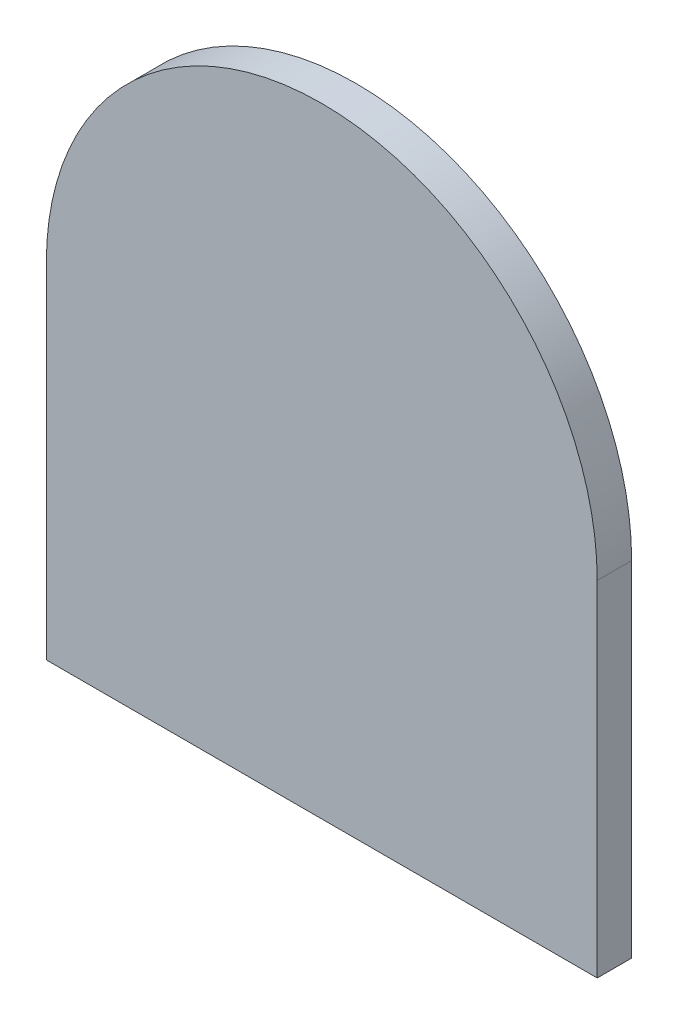
ISO-10303-21;
HEADER;
FILE_DESCRIPTION(('STEP AP214'),'2;1');
FILE_NAME('part.step','',(''),(''),'','','');
FILE_SCHEMA(('AUTOMOTIVE_DESIGN { 1 0 10303 214 1 1 1 1 }'));
ENDSEC;
DATA;
#1=APPLICATION_CONTEXT('core data for automotive mechanical design processes');
#2=APPLICATION_PROTOCOL_DEFINITION('international standard','automotive_design',2000,#1);
#3=PRODUCT_CONTEXT('',#1,'mechanical');
#4=PRODUCT('Part','Part','',(#3));
#5=PRODUCT_RELATED_PRODUCT_CATEGORY('part','',(#4));
#6=PRODUCT_DEFINITION_FORMATION('','',#4);
#7=PRODUCT_DEFINITION_CONTEXT('part definition',#1,'design');
#8=PRODUCT_DEFINITION('design','',#6,#7);
#9=PRODUCT_DEFINITION_SHAPE('','',#8);
#10=(LENGTH_UNIT() NAMED_UNIT(*) SI_UNIT(.MILLI.,.METRE.));
#11=(NAMED_UNIT(*) PLANE_ANGLE_UNIT() SI_UNIT($,.RADIAN.));
#12=(NAMED_UNIT(*) SI_UNIT($,.STERADIAN.) SOLID_ANGLE_UNIT());
#13=UNCERTAINTY_MEASURE_WITH_UNIT(LENGTH_MEASURE(1.E-05),#10,'distance_accuracy_value','');
#14=(GEOMETRIC_REPRESENTATION_CONTEXT(3) GLOBAL_UNCERTAINTY_ASSIGNED_CONTEXT((#13)) GLOBAL_UNIT_ASSIGNED_CONTEXT((#10,
#11,#12)) REPRESENTATION_CONTEXT('',''));
#15=CARTESIAN_POINT('',(0.,0.,0.));
#16=DIRECTION('',(0.,0.,1.));
#17=DIRECTION('',(1.,0.,0.));
#18=AXIS2_PLACEMENT_3D('',#15,#16,#17);
#19=CARTESIAN_POINT('',(254.,0.,-31.75));
#20=DIRECTION('',(1.,0.,0.));
#21=DIRECTION('',(0.,1.,0.));
#22=AXIS2_PLACEMENT_3D('',#19,#20,#21);
#23=PLANE('',#22);
#24=DIRECTION('',(0.,1.,0.));
#25=VECTOR('',#24,1.);
#26=CARTESIAN_POINT('',(254.,0.,0.));
#27=LINE('',#26,#25);
#28=CARTESIAN_POINT('',(254.,0.,0.));
#29=VERTEX_POINT('',#28);
#30=CARTESIAN_POINT('',(254.,317.5,0.));
#31=VERTEX_POINT('',#30);
#32=EDGE_CURVE('E98',#29,#31,#27,.T.);
#33=ORIENTED_EDGE('',*,*,#32,.F.);
#34=DIRECTION('',(0.,0.,1.));
#35=VECTOR('',#34,1.);
#36=CARTESIAN_POINT('',(254.,0.,-31.75));
#37=LINE('',#36,#35);
#38=CARTESIAN_POINT('',(254.,0.,-31.75));
#39=VERTEX_POINT('',#38);
#40=EDGE_CURVE('E11',#39,#29,#37,.T.);
#41=ORIENTED_EDGE('',*,*,#40,.F.);
#42=DIRECTION('',(0.,1.,0.));
#43=VECTOR('',#42,1.);
#44=CARTESIAN_POINT('',(254.,0.,-31.75));
#45=LINE('',#44,#43);
#46=CARTESIAN_POINT('',(254.,317.5,-31.75));
#47=VERTEX_POINT('',#46);
#48=EDGE_CURVE('E92',#39,#47,#45,.T.);
#49=ORIENTED_EDGE('',*,*,#48,.T.);
#50=DIRECTION('',(0.,0.,1.));
#51=VECTOR('',#50,1.);
#52=CARTESIAN_POINT('',(254.,317.5,-31.75));
#53=LINE('',#52,#51);
#54=EDGE_CURVE('E37',#47,#31,#53,.T.);
#55=ORIENTED_EDGE('',*,*,#54,.T.);
#56=EDGE_LOOP('',(#33,#41,#49,#55));
#57=FACE_BOUND('',#56,.T.);
#58=ADVANCED_FACE('F34',(#57),#23,.T.);
#59=CARTESIAN_POINT('',(0.,0.,-31.75));
#60=DIRECTION('',(0.,-1.,0.));
#61=DIRECTION('',(0.,0.,-1.));
#62=AXIS2_PLACEMENT_3D('',#59,#60,#61);
#63=PLANE('',#62);
#64=DIRECTION('',(1.,0.,0.));
#65=VECTOR('',#64,1.);
#66=CARTESIAN_POINT('',(0.,0.,0.));
#67=LINE('',#66,#65);
#68=CARTESIAN_POINT('',(-254.,0.,0.));
#69=VERTEX_POINT('',#68);
#70=EDGE_CURVE('E94',#69,#29,#67,.T.);
#71=ORIENTED_EDGE('',*,*,#70,.F.);
#72=DIRECTION('',(0.,0.,1.));
#73=VECTOR('',#72,1.);
#74=CARTESIAN_POINT('',(-254.,0.,-31.75));
#75=LINE('',#74,#73);
#76=CARTESIAN_POINT('',(-254.,0.,-31.75));
#77=VERTEX_POINT('',#76);
#78=EDGE_CURVE('E43',#77,#69,#75,.T.);
#79=ORIENTED_EDGE('',*,*,#78,.F.);
#80=DIRECTION('',(1.,0.,0.));
#81=VECTOR('',#80,1.);
#82=CARTESIAN_POINT('',(0.,0.,-31.75));
#83=LINE('',#82,#81);
#84=EDGE_CURVE('E89',#77,#39,#83,.T.);
#85=ORIENTED_EDGE('',*,*,#84,.T.);
#86=ORIENTED_EDGE('',*,*,#40,.T.);
#87=EDGE_LOOP('',(#71,#79,#85,#86));
#88=FACE_BOUND('',#87,.T.);
#89=ADVANCED_FACE('F108',(#88),#63,.T.);
#90=CARTESIAN_POINT('',(-254.,0.,-31.75));
#91=DIRECTION('',(-1.,0.,0.));
#92=DIRECTION('',(0.,-1.,0.));
#93=AXIS2_PLACEMENT_3D('',#90,#91,#92);
#94=PLANE('',#93);
#95=DIRECTION('',(0.,-1.,0.));
#96=VECTOR('',#95,1.);
#97=CARTESIAN_POINT('',(-254.,0.,0.));
#98=LINE('',#97,#96);
#99=CARTESIAN_POINT('',(-254.,317.5,0.));
#100=VERTEX_POINT('',#99);
#101=EDGE_CURVE('E84',#100,#69,#98,.T.);
#102=ORIENTED_EDGE('',*,*,#101,.F.);
#103=DIRECTION('',(0.,0.,1.));
#104=VECTOR('',#103,1.);
#105=CARTESIAN_POINT('',(-254.,317.5,-31.75));
#106=LINE('',#105,#104);
#107=CARTESIAN_POINT('',(-254.,317.5,-31.75));
#108=VERTEX_POINT('',#107);
#109=EDGE_CURVE('E79',#108,#100,#106,.T.);
#110=ORIENTED_EDGE('',*,*,#109,.F.);
#111=DIRECTION('',(0.,-1.,0.));
#112=VECTOR('',#111,1.);
#113=CARTESIAN_POINT('',(-254.,0.,-31.75));
#114=LINE('',#113,#112);
#115=EDGE_CURVE('E82',#108,#77,#114,.T.);
#116=ORIENTED_EDGE('',*,*,#115,.T.);
#117=ORIENTED_EDGE('',*,*,#78,.T.);
#118=EDGE_LOOP('',(#102,#110,#116,#117));
#119=FACE_BOUND('',#118,.T.);
#120=ADVANCED_FACE('F81',(#119),#94,.T.);
#121=CARTESIAN_POINT('',(0.,317.5,-31.75));
#122=DIRECTION('',(0.,0.,1.));
#123=DIRECTION('',(1.,0.,0.));
#124=AXIS2_PLACEMENT_3D('',#121,#122,#123);
#125=CYLINDRICAL_SURFACE('',#124,254.);
#126=CARTESIAN_POINT('',(0.,317.5,0.));
#127=DIRECTION('',(0.,0.,1.));
#128=DIRECTION('',(1.,0.,0.));
#129=AXIS2_PLACEMENT_3D('',#126,#127,#128);
#130=CIRCLE('',#129,254.);
#131=EDGE_CURVE('E101',#31,#100,#130,.T.);
#132=ORIENTED_EDGE('',*,*,#131,.F.);
#133=ORIENTED_EDGE('',*,*,#54,.F.);
#134=CARTESIAN_POINT('',(0.,317.5,-31.75));
#135=DIRECTION('',(0.,0.,1.));
#136=DIRECTION('',(1.,0.,0.));
#137=AXIS2_PLACEMENT_3D('',#134,#135,#136);
#138=CIRCLE('',#137,254.);
#139=EDGE_CURVE('E88',#47,#108,#138,.T.);
#140=ORIENTED_EDGE('',*,*,#139,.T.);
#141=ORIENTED_EDGE('',*,*,#109,.T.);
#142=EDGE_LOOP('',(#132,#133,#140,#141));
#143=FACE_BOUND('',#142,.T.);
#144=ADVANCED_FACE('F91',(#143),#125,.T.);
#145=CARTESIAN_POINT('',(0.,0.,-31.75));
#146=DIRECTION('',(0.,0.,1.));
#147=DIRECTION('',(1.,0.,0.));
#148=AXIS2_PLACEMENT_3D('',#145,#146,#147);
#149=PLANE('',#148);
#150=ORIENTED_EDGE('',*,*,#48,.F.);
#151=ORIENTED_EDGE('',*,*,#84,.F.);
#152=ORIENTED_EDGE('',*,*,#115,.F.);
#153=ORIENTED_EDGE('',*,*,#139,.F.);
#154=EDGE_LOOP('',(#150,#151,#152,#153));
#155=FACE_BOUND('',#154,.T.);
#156=ADVANCED_FACE('F87',(#155),#149,.F.);
#157=CARTESIAN_POINT('',(0.,0.,0.));
#158=DIRECTION('',(0.,0.,1.));
#159=DIRECTION('',(1.,0.,0.));
#160=AXIS2_PLACEMENT_3D('',#157,#158,#159);
#161=PLANE('',#160);
#162=ORIENTED_EDGE('',*,*,#32,.T.);
#163=ORIENTED_EDGE('',*,*,#131,.T.);
#164=ORIENTED_EDGE('',*,*,#101,.T.);
#165=ORIENTED_EDGE('',*,*,#70,.T.);
#166=EDGE_LOOP('',(#162,#163,#164,#165));
#167=FACE_BOUND('',#166,.T.);
#168=ADVANCED_FACE('F107',(#167),#161,.T.);
#169=CLOSED_SHELL('',(#58,#89,#120,#144,#156,#168));
#170=MANIFOLD_SOLID_BREP('B2',#169);
#171=ADVANCED_BREP_SHAPE_REPRESENTATION('',(#18,#170),#14);
#172=SHAPE_DEFINITION_REPRESENTATION(#9,#171);
ENDSEC;
END-ISO-10303-21;
